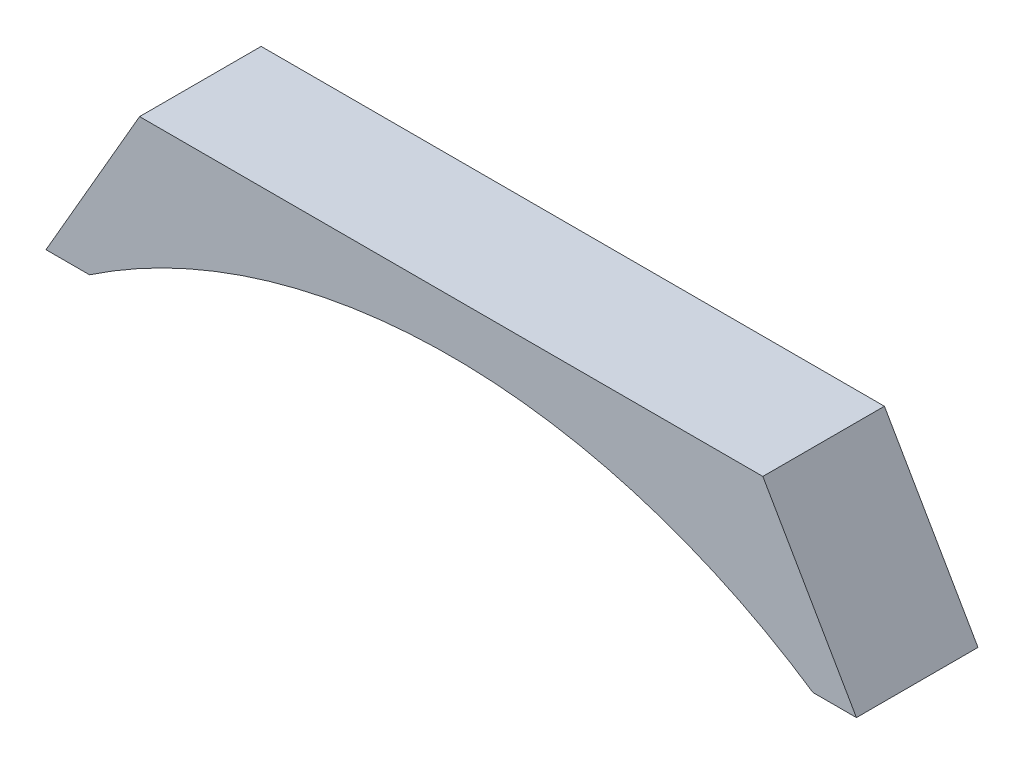
ISO-10303-21;
HEADER;
FILE_DESCRIPTION(('STEP AP214'),'2;1');
FILE_NAME('part.step','',(''),(''),'','','');
FILE_SCHEMA(('AUTOMOTIVE_DESIGN { 1 0 10303 214 1 1 1 1 }'));
ENDSEC;
DATA;
#1=APPLICATION_CONTEXT('core data for automotive mechanical design processes');
#2=APPLICATION_PROTOCOL_DEFINITION('international standard','automotive_design',2000,#1);
#3=PRODUCT_CONTEXT('',#1,'mechanical');
#4=PRODUCT('Part','Part','',(#3));
#5=PRODUCT_RELATED_PRODUCT_CATEGORY('part','',(#4));
#6=PRODUCT_DEFINITION_FORMATION('','',#4);
#7=PRODUCT_DEFINITION_CONTEXT('part definition',#1,'design');
#8=PRODUCT_DEFINITION('design','',#6,#7);
#9=PRODUCT_DEFINITION_SHAPE('','',#8);
#10=(LENGTH_UNIT() NAMED_UNIT(*) SI_UNIT(.MILLI.,.METRE.));
#11=(NAMED_UNIT(*) PLANE_ANGLE_UNIT() SI_UNIT($,.RADIAN.));
#12=(NAMED_UNIT(*) SI_UNIT($,.STERADIAN.) SOLID_ANGLE_UNIT());
#13=UNCERTAINTY_MEASURE_WITH_UNIT(LENGTH_MEASURE(1.E-05),#10,'distance_accuracy_value','');
#14=(GEOMETRIC_REPRESENTATION_CONTEXT(3) GLOBAL_UNCERTAINTY_ASSIGNED_CONTEXT((#13)) GLOBAL_UNIT_ASSIGNED_CONTEXT((#10,
#11,#12)) REPRESENTATION_CONTEXT('',''));
#15=CARTESIAN_POINT('',(0.,0.,0.));
#16=DIRECTION('',(0.,0.,1.));
#17=DIRECTION('',(1.,0.,0.));
#18=AXIS2_PLACEMENT_3D('',#15,#16,#17);
#19=CARTESIAN_POINT('',(78.1646968374167,0.,-19.05));
#20=DIRECTION('',(0.,-1.,0.));
#21=DIRECTION('',(1.,0.,0.));
#22=AXIS2_PLACEMENT_3D('',#19,#20,#21);
#23=PLANE('',#22);
#24=DIRECTION('',(0.,0.,1.));
#25=VECTOR('',#24,1.);
#26=CARTESIAN_POINT('',(42.0240305575548,0.,-19.05));
#27=LINE('',#26,#25);
#28=CARTESIAN_POINT('',(42.0240305575548,0.,-19.05));
#29=VERTEX_POINT('',#28);
#30=CARTESIAN_POINT('',(42.0240305575548,0.,0.));
#31=VERTEX_POINT('',#30);
#32=EDGE_CURVE('E48',#29,#31,#27,.T.);
#33=ORIENTED_EDGE('',*,*,#32,.F.);
#34=DIRECTION('',(1.,0.,0.));
#35=VECTOR('',#34,1.);
#36=CARTESIAN_POINT('',(78.1646968374167,0.,-19.05));
#37=LINE('',#36,#35);
#38=CARTESIAN_POINT('',(48.8353031625836,0.,-19.05));
#39=VERTEX_POINT('',#38);
#40=EDGE_CURVE('E97',#29,#39,#37,.T.);
#41=ORIENTED_EDGE('',*,*,#40,.T.);
#42=DIRECTION('',(0.,0.,1.));
#43=VECTOR('',#42,1.);
#44=CARTESIAN_POINT('',(48.8353031625836,0.,-19.05));
#45=LINE('',#44,#43);
#46=CARTESIAN_POINT('',(48.8353031625836,0.,0.));
#47=VERTEX_POINT('',#46);
#48=EDGE_CURVE('E137',#39,#47,#45,.T.);
#49=ORIENTED_EDGE('',*,*,#48,.T.);
#50=DIRECTION('',(1.,0.,0.));
#51=VECTOR('',#50,1.);
#52=CARTESIAN_POINT('',(78.1646968374167,0.,0.));
#53=LINE('',#52,#51);
#54=EDGE_CURVE('E99',#31,#47,#53,.T.);
#55=ORIENTED_EDGE('',*,*,#54,.F.);
#56=EDGE_LOOP('',(#33,#41,#49,#55));
#57=FACE_BOUND('',#56,.T.);
#58=ADVANCED_FACE('F33',(#57),#23,.T.);
#59=DIRECTION('',(0.,0.,1.));
#60=VECTOR('',#59,1.);
#61=CARTESIAN_POINT('',(-71.3534242323878,0.,-19.05));
#62=LINE('',#61,#60);
#63=CARTESIAN_POINT('',(-71.3534242323878,0.,0.));
#64=VERTEX_POINT('',#63);
#65=CARTESIAN_POINT('',(-71.3534242323878,0.,-19.05));
#66=VERTEX_POINT('',#65);
#67=EDGE_CURVE('E87',#64,#66,#62,.F.);
#68=ORIENTED_EDGE('',*,*,#67,.F.);
#69=CARTESIAN_POINT('',(-78.1646968374167,0.,0.));
#70=VERTEX_POINT('',#69);
#71=EDGE_CURVE('E120',#70,#64,#53,.T.);
#72=ORIENTED_EDGE('',*,*,#71,.F.);
#73=DIRECTION('',(0.,0.,1.));
#74=VECTOR('',#73,1.);
#75=CARTESIAN_POINT('',(-78.1646968374167,0.,-19.05));
#76=LINE('',#75,#74);
#77=CARTESIAN_POINT('',(-78.1646968374167,0.,-19.05));
#78=VERTEX_POINT('',#77);
#79=EDGE_CURVE('E41',#78,#70,#76,.T.);
#80=ORIENTED_EDGE('',*,*,#79,.F.);
#81=EDGE_CURVE('E105',#78,#66,#37,.T.);
#82=ORIENTED_EDGE('',*,*,#81,.T.);
#83=EDGE_LOOP('',(#68,#72,#80,#82));
#84=FACE_BOUND('',#83,.T.);
#85=ADVANCED_FACE('F35',(#84),#23,.T.);
#86=CARTESIAN_POINT('',(-63.5,25.4,-19.05));
#87=DIRECTION('',(0.,1.,0.));
#88=DIRECTION('',(-1.,0.,0.));
#89=AXIS2_PLACEMENT_3D('',#86,#87,#88);
#90=PLANE('',#89);
#91=DIRECTION('',(-1.,0.,0.));
#92=VECTOR('',#91,1.);
#93=CARTESIAN_POINT('',(-63.5,25.4,0.));
#94=LINE('',#93,#92);
#95=CARTESIAN_POINT('',(34.170606325167,25.4,0.));
#96=VERTEX_POINT('',#95);
#97=CARTESIAN_POINT('',(-63.5,25.4,0.));
#98=VERTEX_POINT('',#97);
#99=EDGE_CURVE('E110',#96,#98,#94,.T.);
#100=ORIENTED_EDGE('',*,*,#99,.F.);
#101=DIRECTION('',(0.,0.,-1.));
#102=VECTOR('',#101,1.);
#103=CARTESIAN_POINT('',(34.170606325167,25.4,-19.05));
#104=LINE('',#103,#102);
#105=CARTESIAN_POINT('',(34.170606325167,25.4,-19.05));
#106=VERTEX_POINT('',#105);
#107=EDGE_CURVE('E55',#96,#106,#104,.T.);
#108=ORIENTED_EDGE('',*,*,#107,.T.);
#109=DIRECTION('',(-1.,0.,0.));
#110=VECTOR('',#109,1.);
#111=CARTESIAN_POINT('',(-63.5,25.4,-19.05));
#112=LINE('',#111,#110);
#113=CARTESIAN_POINT('',(-63.5,25.4,-19.05));
#114=VERTEX_POINT('',#113);
#115=EDGE_CURVE('E108',#106,#114,#112,.T.);
#116=ORIENTED_EDGE('',*,*,#115,.T.);
#117=DIRECTION('',(0.,0.,1.));
#118=VECTOR('',#117,1.);
#119=CARTESIAN_POINT('',(-63.5,25.4,-19.05));
#120=LINE('',#119,#118);
#121=EDGE_CURVE('E119',#114,#98,#120,.T.);
#122=ORIENTED_EDGE('',*,*,#121,.T.);
#123=EDGE_LOOP('',(#100,#108,#116,#122));
#124=FACE_BOUND('',#123,.T.);
#125=ADVANCED_FACE('F129',(#124),#90,.T.);
#126=CARTESIAN_POINT('',(0.,0.,-19.05));
#127=DIRECTION('',(0.,0.,-1.));
#128=DIRECTION('',(-1.,0.,0.));
#129=AXIS2_PLACEMENT_3D('',#126,#127,#128);
#130=PLANE('',#129);
#131=CARTESIAN_POINT('',(-14.6646968374165,-84.3145787295331,-19.05));
#132=DIRECTION('',(0.,0.,1.));
#133=DIRECTION('',(1.,0.,0.));
#134=AXIS2_PLACEMENT_3D('',#131,#132,#133);
#135=CIRCLE('',#134,101.6);
#136=EDGE_CURVE('E84',#29,#66,#135,.T.);
#137=ORIENTED_EDGE('',*,*,#136,.T.);
#138=ORIENTED_EDGE('',*,*,#81,.F.);
#139=DIRECTION('',(-0.500000000000004,-0.866025403784437,0.));
#140=VECTOR('',#139,1.);
#141=CARTESIAN_POINT('',(-78.1646968374167,0.,-19.05));
#142=LINE('',#141,#140);
#143=EDGE_CURVE('E116',#114,#78,#142,.T.);
#144=ORIENTED_EDGE('',*,*,#143,.F.);
#145=ORIENTED_EDGE('',*,*,#115,.F.);
#146=DIRECTION('',(0.500000000000005,-0.866025403784436,0.));
#147=VECTOR('',#146,1.);
#148=CARTESIAN_POINT('',(36.6264773719375,21.1463065701561,-19.05));
#149=LINE('',#148,#147);
#150=EDGE_CURVE('E104',#106,#39,#149,.T.);
#151=ORIENTED_EDGE('',*,*,#150,.T.);
#152=ORIENTED_EDGE('',*,*,#40,.F.);
#153=EDGE_LOOP('',(#137,#138,#144,#145,#151,#152));
#154=FACE_BOUND('',#153,.T.);
#155=ADVANCED_FACE('F102',(#154),#130,.T.);
#156=CARTESIAN_POINT('',(0.,0.,0.));
#157=DIRECTION('',(0.,0.,-1.));
#158=DIRECTION('',(-1.,0.,0.));
#159=AXIS2_PLACEMENT_3D('',#156,#157,#158);
#160=PLANE('',#159);
#161=ORIENTED_EDGE('',*,*,#71,.T.);
#162=CARTESIAN_POINT('',(-14.6646968374165,-84.3145787295331,0.));
#163=DIRECTION('',(0.,0.,1.));
#164=DIRECTION('',(1.,0.,0.));
#165=AXIS2_PLACEMENT_3D('',#162,#163,#164);
#166=CIRCLE('',#165,101.6);
#167=EDGE_CURVE('E92',#31,#64,#166,.T.);
#168=ORIENTED_EDGE('',*,*,#167,.F.);
#169=ORIENTED_EDGE('',*,*,#54,.T.);
#170=DIRECTION('',(0.500000000000005,-0.866025403784436,0.));
#171=VECTOR('',#170,1.);
#172=CARTESIAN_POINT('',(36.6264773719375,21.1463065701561,0.));
#173=LINE('',#172,#171);
#174=EDGE_CURVE('E11',#96,#47,#173,.T.);
#175=ORIENTED_EDGE('',*,*,#174,.F.);
#176=ORIENTED_EDGE('',*,*,#99,.T.);
#177=DIRECTION('',(-0.500000000000004,-0.866025403784437,0.));
#178=VECTOR('',#177,1.);
#179=CARTESIAN_POINT('',(-78.1646968374167,0.,0.));
#180=LINE('',#179,#178);
#181=EDGE_CURVE('E106',#98,#70,#180,.T.);
#182=ORIENTED_EDGE('',*,*,#181,.T.);
#183=EDGE_LOOP('',(#161,#168,#169,#175,#176,#182));
#184=FACE_BOUND('',#183,.T.);
#185=ADVANCED_FACE('F135',(#184),#160,.F.);
#186=CARTESIAN_POINT('',(-78.1646968374167,0.,-19.05));
#187=DIRECTION('',(-0.866025403784436,0.500000000000004,0.));
#188=DIRECTION('',(-0.500000000000004,-0.866025403784437,0.));
#189=AXIS2_PLACEMENT_3D('',#186,#187,#188);
#190=PLANE('',#189);
#191=ORIENTED_EDGE('',*,*,#181,.F.);
#192=ORIENTED_EDGE('',*,*,#121,.F.);
#193=ORIENTED_EDGE('',*,*,#143,.T.);
#194=ORIENTED_EDGE('',*,*,#79,.T.);
#195=EDGE_LOOP('',(#191,#192,#193,#194));
#196=FACE_BOUND('',#195,.T.);
#197=ADVANCED_FACE('F132',(#196),#190,.T.);
#198=CARTESIAN_POINT('',(36.6264773719375,21.1463065701561,0.));
#199=DIRECTION('',(0.866025403784436,0.500000000000005,0.));
#200=DIRECTION('',(-0.500000000000005,0.866025403784436,0.));
#201=AXIS2_PLACEMENT_3D('',#198,#199,#200);
#202=PLANE('',#201);
#203=ORIENTED_EDGE('',*,*,#107,.F.);
#204=ORIENTED_EDGE('',*,*,#174,.T.);
#205=ORIENTED_EDGE('',*,*,#48,.F.);
#206=ORIENTED_EDGE('',*,*,#150,.F.);
#207=EDGE_LOOP('',(#203,#204,#205,#206));
#208=FACE_BOUND('',#207,.T.);
#209=ADVANCED_FACE('F136',(#208),#202,.T.);
#210=CARTESIAN_POINT('',(-14.6646968374165,-84.3145787295331,-19.05));
#211=DIRECTION('',(0.,0.,1.));
#212=DIRECTION('',(1.,0.,0.));
#213=AXIS2_PLACEMENT_3D('',#210,#211,#212);
#214=CYLINDRICAL_SURFACE('',#213,101.6);
#215=ORIENTED_EDGE('',*,*,#32,.T.);
#216=ORIENTED_EDGE('',*,*,#167,.T.);
#217=ORIENTED_EDGE('',*,*,#67,.T.);
#218=ORIENTED_EDGE('',*,*,#136,.F.);
#219=EDGE_LOOP('',(#215,#216,#217,#218));
#220=FACE_BOUND('',#219,.T.);
#221=ADVANCED_FACE('F85',(#220),#214,.F.);
#222=CLOSED_SHELL('',(#58,#85,#125,#155,#185,#197,#209,#221));
#223=MANIFOLD_SOLID_BREP('B2',#222);
#224=ADVANCED_BREP_SHAPE_REPRESENTATION('',(#18,#223),#14);
#225=SHAPE_DEFINITION_REPRESENTATION(#9,#224);
ENDSEC;
END-ISO-10303-21;
